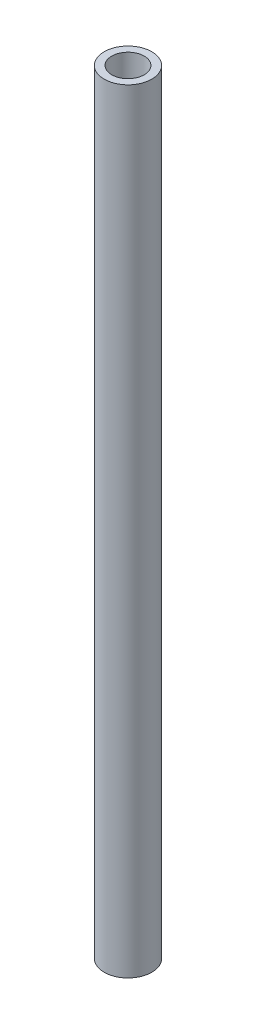
ISO-10303-21;
HEADER;
FILE_DESCRIPTION(('STEP AP214'),'2;1');
FILE_NAME('part.step','',(''),(''),'','','');
FILE_SCHEMA(('AUTOMOTIVE_DESIGN { 1 0 10303 214 1 1 1 1 }'));
ENDSEC;
DATA;
#1=APPLICATION_CONTEXT('core data for automotive mechanical design processes');
#2=APPLICATION_PROTOCOL_DEFINITION('international standard','automotive_design',2000,#1);
#3=PRODUCT_CONTEXT('',#1,'mechanical');
#4=PRODUCT('Part','Part','',(#3));
#5=PRODUCT_RELATED_PRODUCT_CATEGORY('part','',(#4));
#6=PRODUCT_DEFINITION_FORMATION('','',#4);
#7=PRODUCT_DEFINITION_CONTEXT('part definition',#1,'design');
#8=PRODUCT_DEFINITION('design','',#6,#7);
#9=PRODUCT_DEFINITION_SHAPE('','',#8);
#10=(LENGTH_UNIT() NAMED_UNIT(*) SI_UNIT(.MILLI.,.METRE.));
#11=(NAMED_UNIT(*) PLANE_ANGLE_UNIT() SI_UNIT($,.RADIAN.));
#12=(NAMED_UNIT(*) SI_UNIT($,.STERADIAN.) SOLID_ANGLE_UNIT());
#13=UNCERTAINTY_MEASURE_WITH_UNIT(LENGTH_MEASURE(1.E-05),#10,'distance_accuracy_value','');
#14=(GEOMETRIC_REPRESENTATION_CONTEXT(3) GLOBAL_UNCERTAINTY_ASSIGNED_CONTEXT((#13)) GLOBAL_UNIT_ASSIGNED_CONTEXT((#10,
#11,#12)) REPRESENTATION_CONTEXT('',''));
#15=CARTESIAN_POINT('',(0.,0.,0.));
#16=DIRECTION('',(0.,0.,1.));
#17=DIRECTION('',(1.,0.,0.));
#18=AXIS2_PLACEMENT_3D('',#15,#16,#17);
#19=CARTESIAN_POINT('',(0.,130.,0.));
#20=DIRECTION('',(0.,-1.,0.));
#21=DIRECTION('',(0.,0.,-1.));
#22=AXIS2_PLACEMENT_3D('',#19,#20,#21);
#23=CYLINDRICAL_SURFACE('',#22,4.);
#24=CARTESIAN_POINT('',(0.,130.,0.));
#25=DIRECTION('',(0.,1.,0.));
#26=DIRECTION('',(0.,0.,1.));
#27=AXIS2_PLACEMENT_3D('',#24,#25,#26);
#28=CIRCLE('',#27,4.);
#29=CARTESIAN_POINT('',(0.,130.,4.));
#30=VERTEX_POINT('',#29);
#31=EDGE_CURVE('E10',#30,#30,#28,.T.);
#32=ORIENTED_EDGE('',*,*,#31,.F.);
#33=EDGE_LOOP('',(#32));
#34=FACE_BOUND('',#33,.T.);
#35=CARTESIAN_POINT('',(0.,0.,0.));
#36=DIRECTION('',(0.,1.,0.));
#37=DIRECTION('',(0.,0.,1.));
#38=AXIS2_PLACEMENT_3D('',#35,#36,#37);
#39=CIRCLE('',#38,4.);
#40=CARTESIAN_POINT('',(0.,0.,4.));
#41=VERTEX_POINT('',#40);
#42=EDGE_CURVE('E44',#41,#41,#39,.T.);
#43=ORIENTED_EDGE('',*,*,#42,.T.);
#44=EDGE_LOOP('',(#43));
#45=FACE_BOUND('',#44,.T.);
#46=ADVANCED_FACE('F41',(#34,#45),#23,.T.);
#47=CARTESIAN_POINT('',(0.,130.,0.));
#48=DIRECTION('',(0.,1.,0.));
#49=DIRECTION('',(0.,0.,1.));
#50=AXIS2_PLACEMENT_3D('',#47,#48,#49);
#51=PLANE('',#50);
#52=CARTESIAN_POINT('',(0.,130.,0.));
#53=DIRECTION('',(0.,1.,0.));
#54=DIRECTION('',(0.,0.,1.));
#55=AXIS2_PLACEMENT_3D('',#52,#53,#54);
#56=CIRCLE('',#55,2.73);
#57=CARTESIAN_POINT('',(0.,130.,2.73));
#58=VERTEX_POINT('',#57);
#59=EDGE_CURVE('E53',#58,#58,#56,.T.);
#60=ORIENTED_EDGE('',*,*,#59,.F.);
#61=EDGE_LOOP('',(#60));
#62=FACE_BOUND('',#61,.T.);
#63=ORIENTED_EDGE('',*,*,#31,.T.);
#64=EDGE_LOOP('',(#63));
#65=FACE_BOUND('',#64,.T.);
#66=ADVANCED_FACE('F66',(#62,#65),#51,.T.);
#67=CARTESIAN_POINT('',(0.,0.,0.));
#68=DIRECTION('',(0.,1.,0.));
#69=DIRECTION('',(0.,0.,1.));
#70=AXIS2_PLACEMENT_3D('',#67,#68,#69);
#71=PLANE('',#70);
#72=CARTESIAN_POINT('',(0.,0.,0.));
#73=DIRECTION('',(0.,1.,0.));
#74=DIRECTION('',(0.,0.,1.));
#75=AXIS2_PLACEMENT_3D('',#72,#73,#74);
#76=CIRCLE('',#75,2.73);
#77=CARTESIAN_POINT('',(0.,0.,2.73));
#78=VERTEX_POINT('',#77);
#79=EDGE_CURVE('E55',#78,#78,#76,.T.);
#80=ORIENTED_EDGE('',*,*,#79,.T.);
#81=EDGE_LOOP('',(#80));
#82=FACE_BOUND('',#81,.T.);
#83=ORIENTED_EDGE('',*,*,#42,.F.);
#84=EDGE_LOOP('',(#83));
#85=FACE_BOUND('',#84,.T.);
#86=ADVANCED_FACE('F68',(#82,#85),#71,.F.);
#87=CARTESIAN_POINT('',(0.,130.,0.));
#88=DIRECTION('',(0.,-1.,0.));
#89=DIRECTION('',(0.,0.,-1.));
#90=AXIS2_PLACEMENT_3D('',#87,#88,#89);
#91=CYLINDRICAL_SURFACE('',#90,2.73);
#92=ORIENTED_EDGE('',*,*,#59,.T.);
#93=EDGE_LOOP('',(#92));
#94=FACE_BOUND('',#93,.T.);
#95=ORIENTED_EDGE('',*,*,#79,.F.);
#96=EDGE_LOOP('',(#95));
#97=FACE_BOUND('',#96,.T.);
#98=ADVANCED_FACE('F63',(#94,#97),#91,.F.);
#99=CLOSED_SHELL('',(#46,#66,#86,#98));
#100=MANIFOLD_SOLID_BREP('B2',#99);
#101=ADVANCED_BREP_SHAPE_REPRESENTATION('',(#18,#100),#14);
#102=SHAPE_DEFINITION_REPRESENTATION(#9,#101);
ENDSEC;
END-ISO-10303-21;
